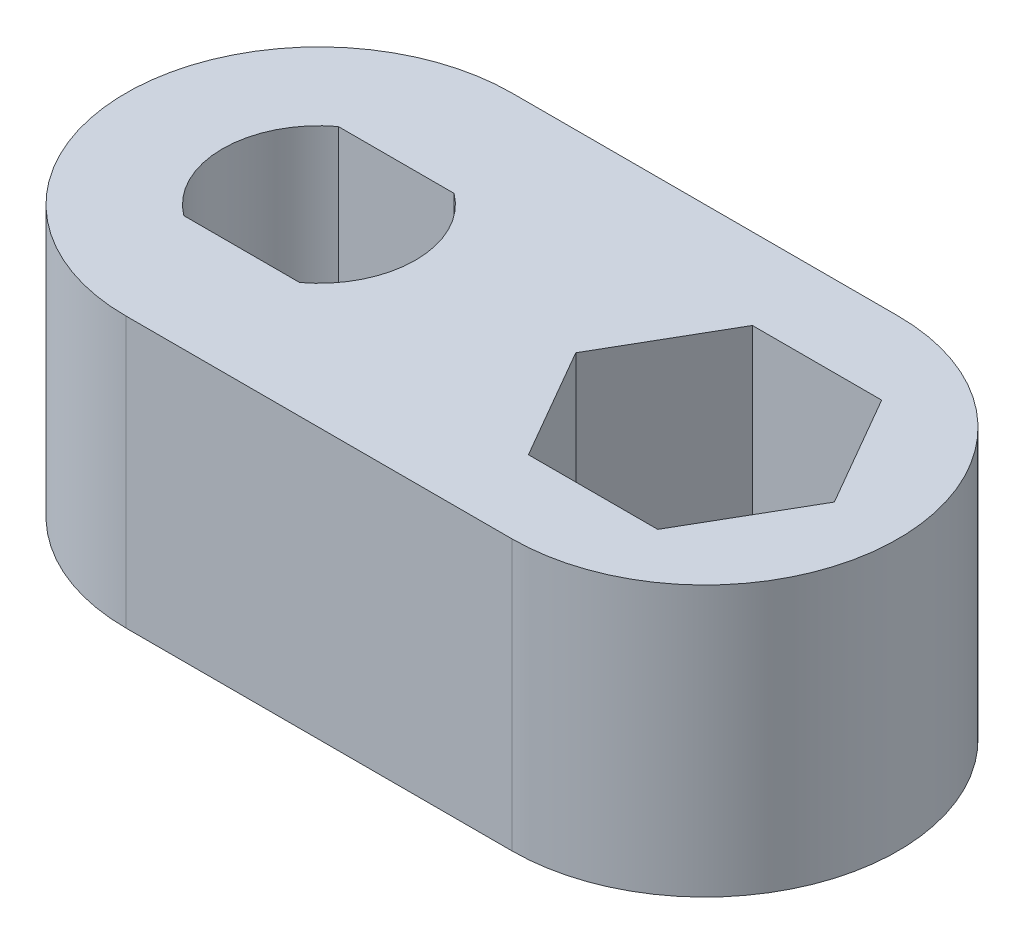
ISO-10303-21;
HEADER;
FILE_DESCRIPTION(('STEP AP214'),'2;1');
FILE_NAME('part.step','',(''),(''),'','','');
FILE_SCHEMA(('AUTOMOTIVE_DESIGN { 1 0 10303 214 1 1 1 1 }'));
ENDSEC;
DATA;
#1=APPLICATION_CONTEXT('core data for automotive mechanical design processes');
#2=APPLICATION_PROTOCOL_DEFINITION('international standard','automotive_design',2000,#1);
#3=PRODUCT_CONTEXT('',#1,'mechanical');
#4=PRODUCT('Part','Part','',(#3));
#5=PRODUCT_RELATED_PRODUCT_CATEGORY('part','',(#4));
#6=PRODUCT_DEFINITION_FORMATION('','',#4);
#7=PRODUCT_DEFINITION_CONTEXT('part definition',#1,'design');
#8=PRODUCT_DEFINITION('design','',#6,#7);
#9=PRODUCT_DEFINITION_SHAPE('','',#8);
#10=(LENGTH_UNIT() NAMED_UNIT(*) SI_UNIT(.MILLI.,.METRE.));
#11=(NAMED_UNIT(*) PLANE_ANGLE_UNIT() SI_UNIT($,.RADIAN.));
#12=(NAMED_UNIT(*) SI_UNIT($,.STERADIAN.) SOLID_ANGLE_UNIT());
#13=UNCERTAINTY_MEASURE_WITH_UNIT(LENGTH_MEASURE(1.E-05),#10,'distance_accuracy_value','');
#14=(GEOMETRIC_REPRESENTATION_CONTEXT(3) GLOBAL_UNCERTAINTY_ASSIGNED_CONTEXT((#13)) GLOBAL_UNIT_ASSIGNED_CONTEXT((#10,
#11,#12)) REPRESENTATION_CONTEXT('',''));
#15=CARTESIAN_POINT('',(0.,0.,0.));
#16=DIRECTION('',(0.,0.,1.));
#17=DIRECTION('',(1.,0.,0.));
#18=AXIS2_PLACEMENT_3D('',#15,#16,#17);
#19=CARTESIAN_POINT('',(10.,7.,0.));
#20=DIRECTION('',(0.,1.,0.));
#21=DIRECTION('',(0.,0.,1.));
#22=AXIS2_PLACEMENT_3D('',#19,#20,#21);
#23=CYLINDRICAL_SURFACE('',#22,2.07500000000001);
#24=CARTESIAN_POINT('',(10.,0.,0.));
#25=DIRECTION('',(0.,1.,0.));
#26=DIRECTION('',(0.,0.,1.));
#27=AXIS2_PLACEMENT_3D('',#24,#25,#26);
#28=CIRCLE('',#27,2.07500000000001);
#29=CARTESIAN_POINT('',(10.,0.,2.07500000000001));
#30=VERTEX_POINT('',#29);
#31=EDGE_CURVE('E202',#30,#30,#28,.T.);
#32=ORIENTED_EDGE('',*,*,#31,.F.);
#33=EDGE_LOOP('',(#32));
#34=FACE_BOUND('',#33,.T.);
#35=CARTESIAN_POINT('',(10.,2.,0.));
#36=DIRECTION('',(0.,1.,0.));
#37=DIRECTION('',(0.,0.,1.));
#38=AXIS2_PLACEMENT_3D('',#35,#36,#37);
#39=CIRCLE('',#38,2.07500000000001);
#40=CARTESIAN_POINT('',(10.,2.,2.07500000000001));
#41=VERTEX_POINT('',#40);
#42=EDGE_CURVE('E44',#41,#41,#39,.F.);
#43=ORIENTED_EDGE('',*,*,#42,.F.);
#44=EDGE_LOOP('',(#43));
#45=FACE_BOUND('',#44,.T.);
#46=ADVANCED_FACE('F40',(#34,#45),#23,.F.);
#47=CARTESIAN_POINT('',(0.,7.,5.));
#48=DIRECTION('',(0.,0.,-1.));
#49=DIRECTION('',(-1.,0.,0.));
#50=AXIS2_PLACEMENT_3D('',#47,#48,#49);
#51=PLANE('',#50);
#52=DIRECTION('',(1.,0.,0.));
#53=VECTOR('',#52,1.);
#54=CARTESIAN_POINT('',(0.,0.,5.));
#55=LINE('',#54,#53);
#56=CARTESIAN_POINT('',(0.,0.,5.));
#57=VERTEX_POINT('',#56);
#58=CARTESIAN_POINT('',(10.,0.,5.));
#59=VERTEX_POINT('',#58);
#60=EDGE_CURVE('E225',#57,#59,#55,.T.);
#61=ORIENTED_EDGE('',*,*,#60,.T.);
#62=DIRECTION('',(0.,-1.,0.));
#63=VECTOR('',#62,1.);
#64=CARTESIAN_POINT('',(10.,7.,5.));
#65=LINE('',#64,#63);
#66=CARTESIAN_POINT('',(10.,7.,5.));
#67=VERTEX_POINT('',#66);
#68=EDGE_CURVE('E11',#67,#59,#65,.T.);
#69=ORIENTED_EDGE('',*,*,#68,.F.);
#70=DIRECTION('',(1.,0.,0.));
#71=VECTOR('',#70,1.);
#72=CARTESIAN_POINT('',(0.,7.,5.));
#73=LINE('',#72,#71);
#74=CARTESIAN_POINT('',(0.,7.,5.));
#75=VERTEX_POINT('',#74);
#76=EDGE_CURVE('E232',#75,#67,#73,.T.);
#77=ORIENTED_EDGE('',*,*,#76,.F.);
#78=DIRECTION('',(0.,-1.,0.));
#79=VECTOR('',#78,1.);
#80=CARTESIAN_POINT('',(0.,7.,5.));
#81=LINE('',#80,#79);
#82=EDGE_CURVE('E243',#75,#57,#81,.T.);
#83=ORIENTED_EDGE('',*,*,#82,.T.);
#84=EDGE_LOOP('',(#61,#69,#77,#83));
#85=FACE_BOUND('',#84,.T.);
#86=ADVANCED_FACE('F42',(#85),#51,.F.);
#87=CARTESIAN_POINT('',(10.,7.,0.));
#88=DIRECTION('',(0.,-1.,0.));
#89=DIRECTION('',(0.,0.,-1.));
#90=AXIS2_PLACEMENT_3D('',#87,#88,#89);
#91=CYLINDRICAL_SURFACE('',#90,5.);
#92=CARTESIAN_POINT('',(10.,0.,0.));
#93=DIRECTION('',(0.,1.,0.));
#94=DIRECTION('',(0.,0.,1.));
#95=AXIS2_PLACEMENT_3D('',#92,#93,#94);
#96=CIRCLE('',#95,5.);
#97=CARTESIAN_POINT('',(10.,0.,-5.));
#98=VERTEX_POINT('',#97);
#99=EDGE_CURVE('E246',#59,#98,#96,.T.);
#100=ORIENTED_EDGE('',*,*,#99,.T.);
#101=DIRECTION('',(0.,-1.,0.));
#102=VECTOR('',#101,1.);
#103=CARTESIAN_POINT('',(10.,7.,-5.));
#104=LINE('',#103,#102);
#105=CARTESIAN_POINT('',(10.,7.,-5.));
#106=VERTEX_POINT('',#105);
#107=EDGE_CURVE('E49',#106,#98,#104,.T.);
#108=ORIENTED_EDGE('',*,*,#107,.F.);
#109=CARTESIAN_POINT('',(10.,7.,0.));
#110=DIRECTION('',(0.,1.,0.));
#111=DIRECTION('',(0.,0.,1.));
#112=AXIS2_PLACEMENT_3D('',#109,#110,#111);
#113=CIRCLE('',#112,5.);
#114=EDGE_CURVE('E235',#67,#106,#113,.T.);
#115=ORIENTED_EDGE('',*,*,#114,.F.);
#116=ORIENTED_EDGE('',*,*,#68,.T.);
#117=EDGE_LOOP('',(#100,#108,#115,#116));
#118=FACE_BOUND('',#117,.T.);
#119=ADVANCED_FACE('F273',(#118),#91,.T.);
#120=CARTESIAN_POINT('',(0.,7.,-5.));
#121=DIRECTION('',(0.,0.,-1.));
#122=DIRECTION('',(-1.,0.,0.));
#123=AXIS2_PLACEMENT_3D('',#120,#121,#122);
#124=PLANE('',#123);
#125=DIRECTION('',(1.,0.,0.));
#126=VECTOR('',#125,1.);
#127=CARTESIAN_POINT('',(0.,0.,-5.));
#128=LINE('',#127,#126);
#129=CARTESIAN_POINT('',(0.,0.,-5.));
#130=VERTEX_POINT('',#129);
#131=EDGE_CURVE('E249',#130,#98,#128,.T.);
#132=ORIENTED_EDGE('',*,*,#131,.F.);
#133=DIRECTION('',(0.,-1.,0.));
#134=VECTOR('',#133,1.);
#135=CARTESIAN_POINT('',(0.,7.,-5.));
#136=LINE('',#135,#134);
#137=CARTESIAN_POINT('',(0.,7.,-5.));
#138=VERTEX_POINT('',#137);
#139=EDGE_CURVE('E255',#138,#130,#136,.T.);
#140=ORIENTED_EDGE('',*,*,#139,.F.);
#141=DIRECTION('',(1.,0.,0.));
#142=VECTOR('',#141,1.);
#143=CARTESIAN_POINT('',(0.,7.,-5.));
#144=LINE('',#143,#142);
#145=EDGE_CURVE('E238',#138,#106,#144,.T.);
#146=ORIENTED_EDGE('',*,*,#145,.T.);
#147=ORIENTED_EDGE('',*,*,#107,.T.);
#148=EDGE_LOOP('',(#132,#140,#146,#147));
#149=FACE_BOUND('',#148,.T.);
#150=ADVANCED_FACE('F311',(#149),#124,.T.);
#151=CARTESIAN_POINT('',(0.,7.,0.));
#152=DIRECTION('',(0.,-1.,0.));
#153=DIRECTION('',(0.,0.,-1.));
#154=AXIS2_PLACEMENT_3D('',#151,#152,#153);
#155=CYLINDRICAL_SURFACE('',#154,5.);
#156=CARTESIAN_POINT('',(0.,0.,0.));
#157=DIRECTION('',(0.,1.,0.));
#158=DIRECTION('',(0.,0.,1.));
#159=AXIS2_PLACEMENT_3D('',#156,#157,#158);
#160=CIRCLE('',#159,5.);
#161=EDGE_CURVE('E236',#130,#57,#160,.T.);
#162=ORIENTED_EDGE('',*,*,#161,.T.);
#163=ORIENTED_EDGE('',*,*,#82,.F.);
#164=CARTESIAN_POINT('',(0.,7.,0.));
#165=DIRECTION('',(0.,1.,0.));
#166=DIRECTION('',(0.,0.,1.));
#167=AXIS2_PLACEMENT_3D('',#164,#165,#166);
#168=CIRCLE('',#167,5.);
#169=EDGE_CURVE('E241',#138,#75,#168,.T.);
#170=ORIENTED_EDGE('',*,*,#169,.F.);
#171=ORIENTED_EDGE('',*,*,#139,.T.);
#172=EDGE_LOOP('',(#162,#163,#170,#171));
#173=FACE_BOUND('',#172,.T.);
#174=ADVANCED_FACE('F305',(#173),#155,.T.);
#175=CARTESIAN_POINT('',(0.,7.,0.));
#176=DIRECTION('',(0.,1.,0.));
#177=DIRECTION('',(0.,0.,1.));
#178=AXIS2_PLACEMENT_3D('',#175,#176,#177);
#179=PLANE('',#178);
#180=DIRECTION('',(0.499999999999999,0.,-0.866025403784439));
#181=VECTOR('',#180,1.);
#182=CARTESIAN_POINT('',(11.6743157806499,7.,2.90000000000001));
#183=LINE('',#182,#181);
#184=CARTESIAN_POINT('',(11.6743157806499,7.,2.90000000000001));
#185=VERTEX_POINT('',#184);
#186=CARTESIAN_POINT('',(13.3486315612998,7.,0.));
#187=VERTEX_POINT('',#186);
#188=EDGE_CURVE('E57',#185,#187,#183,.T.);
#189=ORIENTED_EDGE('',*,*,#188,.F.);
#190=DIRECTION('',(1.,0.,0.));
#191=VECTOR('',#190,1.);
#192=CARTESIAN_POINT('',(8.32568421935009,7.,2.90000000000001));
#193=LINE('',#192,#191);
#194=CARTESIAN_POINT('',(8.32568421935009,7.,2.90000000000001));
#195=VERTEX_POINT('',#194);
#196=EDGE_CURVE('E165',#195,#185,#193,.T.);
#197=ORIENTED_EDGE('',*,*,#196,.F.);
#198=DIRECTION('',(0.5,0.,0.866025403784439));
#199=VECTOR('',#198,1.);
#200=CARTESIAN_POINT('',(6.65136843870017,7.,0.));
#201=LINE('',#200,#199);
#202=CARTESIAN_POINT('',(6.65136843870017,7.,0.));
#203=VERTEX_POINT('',#202);
#204=EDGE_CURVE('E168',#203,#195,#201,.T.);
#205=ORIENTED_EDGE('',*,*,#204,.F.);
#206=DIRECTION('',(-0.5,0.,0.866025403784438));
#207=VECTOR('',#206,1.);
#208=CARTESIAN_POINT('',(8.32568421935009,7.,-2.9));
#209=LINE('',#208,#207);
#210=CARTESIAN_POINT('',(8.32568421935009,7.,-2.9));
#211=VERTEX_POINT('',#210);
#212=EDGE_CURVE('E184',#211,#203,#209,.T.);
#213=ORIENTED_EDGE('',*,*,#212,.F.);
#214=DIRECTION('',(-1.,0.,0.));
#215=VECTOR('',#214,1.);
#216=CARTESIAN_POINT('',(11.6743157806499,7.,-2.9));
#217=LINE('',#216,#215);
#218=CARTESIAN_POINT('',(11.6743157806499,7.,-2.9));
#219=VERTEX_POINT('',#218);
#220=EDGE_CURVE('E181',#219,#211,#217,.T.);
#221=ORIENTED_EDGE('',*,*,#220,.F.);
#222=DIRECTION('',(-0.5,0.,-0.866025403784439));
#223=VECTOR('',#222,1.);
#224=CARTESIAN_POINT('',(13.3486315612998,7.,0.));
#225=LINE('',#224,#223);
#226=EDGE_CURVE('E179',#187,#219,#225,.T.);
#227=ORIENTED_EDGE('',*,*,#226,.F.);
#228=EDGE_LOOP('',(#189,#197,#205,#213,#221,#227));
#229=FACE_BOUND('',#228,.T.);
#230=DIRECTION('',(1.,0.,0.));
#231=VECTOR('',#230,1.);
#232=CARTESIAN_POINT('',(0.,7.,2.));
#233=LINE('',#232,#231);
#234=CARTESIAN_POINT('',(-1.5,7.,2.));
#235=VERTEX_POINT('',#234);
#236=CARTESIAN_POINT('',(1.5,7.,2.));
#237=VERTEX_POINT('',#236);
#238=EDGE_CURVE('E65',#235,#237,#233,.T.);
#239=ORIENTED_EDGE('',*,*,#238,.F.);
#240=CARTESIAN_POINT('',(0.,7.,0.));
#241=DIRECTION('',(0.,1.,0.));
#242=DIRECTION('',(0.,0.,1.));
#243=AXIS2_PLACEMENT_3D('',#240,#241,#242);
#244=CIRCLE('',#243,2.5);
#245=CARTESIAN_POINT('',(-1.5,7.,-2.));
#246=VERTEX_POINT('',#245);
#247=EDGE_CURVE('E210',#246,#235,#244,.T.);
#248=ORIENTED_EDGE('',*,*,#247,.F.);
#249=DIRECTION('',(1.,0.,0.));
#250=VECTOR('',#249,1.);
#251=CARTESIAN_POINT('',(0.,7.,-2.));
#252=LINE('',#251,#250);
#253=CARTESIAN_POINT('',(1.5,7.,-2.));
#254=VERTEX_POINT('',#253);
#255=EDGE_CURVE('E220',#246,#254,#252,.T.);
#256=ORIENTED_EDGE('',*,*,#255,.T.);
#257=EDGE_CURVE('E217',#237,#254,#244,.T.);
#258=ORIENTED_EDGE('',*,*,#257,.F.);
#259=EDGE_LOOP('',(#239,#248,#256,#258));
#260=FACE_BOUND('',#259,.T.);
#261=ORIENTED_EDGE('',*,*,#76,.T.);
#262=ORIENTED_EDGE('',*,*,#114,.T.);
#263=ORIENTED_EDGE('',*,*,#145,.F.);
#264=ORIENTED_EDGE('',*,*,#169,.T.);
#265=EDGE_LOOP('',(#261,#262,#263,#264));
#266=FACE_BOUND('',#265,.T.);
#267=ADVANCED_FACE('F303',(#229,#260,#266),#179,.T.);
#268=CARTESIAN_POINT('',(0.,0.,0.));
#269=DIRECTION('',(0.,1.,0.));
#270=DIRECTION('',(0.,0.,1.));
#271=AXIS2_PLACEMENT_3D('',#268,#269,#270);
#272=PLANE('',#271);
#273=ORIENTED_EDGE('',*,*,#31,.T.);
#274=EDGE_LOOP('',(#273));
#275=FACE_BOUND('',#274,.T.);
#276=CARTESIAN_POINT('',(0.,0.,0.));
#277=DIRECTION('',(0.,-1.,0.));
#278=DIRECTION('',(0.,0.,-1.));
#279=AXIS2_PLACEMENT_3D('',#276,#277,#278);
#280=CIRCLE('',#279,3.36);
#281=CARTESIAN_POINT('',(0.,0.,-3.36));
#282=VERTEX_POINT('',#281);
#283=EDGE_CURVE('E198',#282,#282,#280,.T.);
#284=ORIENTED_EDGE('',*,*,#283,.F.);
#285=EDGE_LOOP('',(#284));
#286=FACE_BOUND('',#285,.T.);
#287=ORIENTED_EDGE('',*,*,#60,.F.);
#288=ORIENTED_EDGE('',*,*,#161,.F.);
#289=ORIENTED_EDGE('',*,*,#131,.T.);
#290=ORIENTED_EDGE('',*,*,#99,.F.);
#291=EDGE_LOOP('',(#287,#288,#289,#290));
#292=FACE_BOUND('',#291,.T.);
#293=ADVANCED_FACE('F302',(#275,#286,#292),#272,.F.);
#294=CARTESIAN_POINT('',(0.,3.,2.));
#295=DIRECTION('',(0.,0.,1.));
#296=DIRECTION('',(1.,0.,0.));
#297=AXIS2_PLACEMENT_3D('',#294,#295,#296);
#298=PLANE('',#297);
#299=ORIENTED_EDGE('',*,*,#238,.T.);
#300=DIRECTION('',(0.,1.,0.));
#301=VECTOR('',#300,1.);
#302=CARTESIAN_POINT('',(1.5,3.,2.));
#303=LINE('',#302,#301);
#304=CARTESIAN_POINT('',(1.5,3.,2.));
#305=VERTEX_POINT('',#304);
#306=EDGE_CURVE('E230',#305,#237,#303,.T.);
#307=ORIENTED_EDGE('',*,*,#306,.F.);
#308=DIRECTION('',(1.,0.,0.));
#309=VECTOR('',#308,1.);
#310=CARTESIAN_POINT('',(0.,3.,2.));
#311=LINE('',#310,#309);
#312=CARTESIAN_POINT('',(-1.5,3.,2.));
#313=VERTEX_POINT('',#312);
#314=EDGE_CURVE('E206',#313,#305,#311,.T.);
#315=ORIENTED_EDGE('',*,*,#314,.F.);
#316=DIRECTION('',(0.,1.,0.));
#317=VECTOR('',#316,1.);
#318=CARTESIAN_POINT('',(-1.5,3.,2.));
#319=LINE('',#318,#317);
#320=EDGE_CURVE('E223',#313,#235,#319,.T.);
#321=ORIENTED_EDGE('',*,*,#320,.T.);
#322=EDGE_LOOP('',(#299,#307,#315,#321));
#323=FACE_BOUND('',#322,.T.);
#324=ADVANCED_FACE('F295',(#323),#298,.F.);
#325=CARTESIAN_POINT('',(0.,3.,0.));
#326=DIRECTION('',(0.,1.,0.));
#327=DIRECTION('',(0.,0.,1.));
#328=AXIS2_PLACEMENT_3D('',#325,#326,#327);
#329=CYLINDRICAL_SURFACE('',#328,2.5);
#330=ORIENTED_EDGE('',*,*,#247,.T.);
#331=ORIENTED_EDGE('',*,*,#320,.F.);
#332=CARTESIAN_POINT('',(0.,3.,0.));
#333=DIRECTION('',(0.,1.,0.));
#334=DIRECTION('',(0.,0.,1.));
#335=AXIS2_PLACEMENT_3D('',#332,#333,#334);
#336=CIRCLE('',#335,2.5);
#337=CARTESIAN_POINT('',(-1.5,3.,-2.));
#338=VERTEX_POINT('',#337);
#339=EDGE_CURVE('E214',#338,#313,#336,.T.);
#340=ORIENTED_EDGE('',*,*,#339,.F.);
#341=DIRECTION('',(0.,1.,0.));
#342=VECTOR('',#341,1.);
#343=CARTESIAN_POINT('',(-1.5,3.,-2.));
#344=LINE('',#343,#342);
#345=EDGE_CURVE('E226',#338,#246,#344,.T.);
#346=ORIENTED_EDGE('',*,*,#345,.T.);
#347=EDGE_LOOP('',(#330,#331,#340,#346));
#348=FACE_BOUND('',#347,.T.);
#349=ADVANCED_FACE('F291',(#348),#329,.F.);
#350=CARTESIAN_POINT('',(0.,3.,-2.));
#351=DIRECTION('',(0.,0.,1.));
#352=DIRECTION('',(1.,0.,0.));
#353=AXIS2_PLACEMENT_3D('',#350,#351,#352);
#354=PLANE('',#353);
#355=ORIENTED_EDGE('',*,*,#255,.F.);
#356=ORIENTED_EDGE('',*,*,#345,.F.);
#357=DIRECTION('',(1.,0.,0.));
#358=VECTOR('',#357,1.);
#359=CARTESIAN_POINT('',(0.,3.,-2.));
#360=LINE('',#359,#358);
#361=CARTESIAN_POINT('',(1.5,3.,-2.));
#362=VERTEX_POINT('',#361);
#363=EDGE_CURVE('E213',#338,#362,#360,.T.);
#364=ORIENTED_EDGE('',*,*,#363,.T.);
#365=DIRECTION('',(0.,1.,0.));
#366=VECTOR('',#365,1.);
#367=CARTESIAN_POINT('',(1.5,3.,-2.));
#368=LINE('',#367,#366);
#369=EDGE_CURVE('E228',#362,#254,#368,.T.);
#370=ORIENTED_EDGE('',*,*,#369,.T.);
#371=EDGE_LOOP('',(#355,#356,#364,#370));
#372=FACE_BOUND('',#371,.T.);
#373=ADVANCED_FACE('F294',(#372),#354,.T.);
#374=ORIENTED_EDGE('',*,*,#257,.T.);
#375=ORIENTED_EDGE('',*,*,#369,.F.);
#376=EDGE_CURVE('E209',#305,#362,#336,.T.);
#377=ORIENTED_EDGE('',*,*,#376,.F.);
#378=ORIENTED_EDGE('',*,*,#306,.T.);
#379=EDGE_LOOP('',(#374,#375,#377,#378));
#380=FACE_BOUND('',#379,.T.);
#381=ADVANCED_FACE('F289',(#380),#329,.F.);
#382=CARTESIAN_POINT('',(0.,3.,0.));
#383=DIRECTION('',(0.,1.,0.));
#384=DIRECTION('',(0.,0.,1.));
#385=AXIS2_PLACEMENT_3D('',#382,#383,#384);
#386=PLANE('',#385);
#387=CARTESIAN_POINT('',(0.,3.,0.));
#388=DIRECTION('',(0.,1.,0.));
#389=DIRECTION('',(0.,0.,1.));
#390=AXIS2_PLACEMENT_3D('',#387,#388,#389);
#391=CIRCLE('',#390,1.7);
#392=CARTESIAN_POINT('',(0.,3.,1.7));
#393=VERTEX_POINT('',#392);
#394=EDGE_CURVE('E205',#393,#393,#391,.T.);
#395=ORIENTED_EDGE('',*,*,#394,.F.);
#396=EDGE_LOOP('',(#395));
#397=FACE_BOUND('',#396,.T.);
#398=ORIENTED_EDGE('',*,*,#314,.T.);
#399=ORIENTED_EDGE('',*,*,#376,.T.);
#400=ORIENTED_EDGE('',*,*,#363,.F.);
#401=ORIENTED_EDGE('',*,*,#339,.T.);
#402=EDGE_LOOP('',(#398,#399,#400,#401));
#403=FACE_BOUND('',#402,.T.);
#404=ADVANCED_FACE('F285',(#397,#403),#386,.T.);
#405=CARTESIAN_POINT('',(0.,0.,0.));
#406=DIRECTION('',(0.,-1.,0.));
#407=DIRECTION('',(0.,0.,-1.));
#408=AXIS2_PLACEMENT_3D('',#405,#406,#407);
#409=CYLINDRICAL_SURFACE('',#408,1.7);
#410=ORIENTED_EDGE('',*,*,#394,.T.);
#411=EDGE_LOOP('',(#410));
#412=FACE_BOUND('',#411,.T.);
#413=CARTESIAN_POINT('',(0.,1.66,0.));
#414=DIRECTION('',(0.,-1.,0.));
#415=DIRECTION('',(0.,0.,-1.));
#416=AXIS2_PLACEMENT_3D('',#413,#414,#415);
#417=CIRCLE('',#416,1.7);
#418=CARTESIAN_POINT('',(0.,1.66,-1.7));
#419=VERTEX_POINT('',#418);
#420=EDGE_CURVE('E201',#419,#419,#417,.T.);
#421=ORIENTED_EDGE('',*,*,#420,.T.);
#422=EDGE_LOOP('',(#421));
#423=FACE_BOUND('',#422,.T.);
#424=ADVANCED_FACE('F281',(#412,#423),#409,.F.);
#425=CARTESIAN_POINT('',(0.,0.,0.));
#426=DIRECTION('',(0.,-1.,0.));
#427=DIRECTION('',(0.,0.,-1.));
#428=AXIS2_PLACEMENT_3D('',#425,#426,#427);
#429=CONICAL_SURFACE('',#428,3.36,0.785398163397448);
#430=ORIENTED_EDGE('',*,*,#420,.F.);
#431=EDGE_LOOP('',(#430));
#432=FACE_BOUND('',#431,.T.);
#433=ORIENTED_EDGE('',*,*,#283,.T.);
#434=EDGE_LOOP('',(#433));
#435=FACE_BOUND('',#434,.T.);
#436=ADVANCED_FACE('F278',(#432,#435),#429,.F.);
#437=CARTESIAN_POINT('',(0.,2.,0.));
#438=DIRECTION('',(0.,1.,0.));
#439=DIRECTION('',(0.,0.,1.));
#440=AXIS2_PLACEMENT_3D('',#437,#438,#439);
#441=PLANE('',#440);
#442=DIRECTION('',(0.499999999999999,0.,-0.866025403784439));
#443=VECTOR('',#442,1.);
#444=CARTESIAN_POINT('',(11.6743157806499,2.,2.90000000000001));
#445=LINE('',#444,#443);
#446=CARTESIAN_POINT('',(11.6743157806499,2.,2.90000000000001));
#447=VERTEX_POINT('',#446);
#448=CARTESIAN_POINT('',(13.3486315612998,2.,0.));
#449=VERTEX_POINT('',#448);
#450=EDGE_CURVE('E145',#447,#449,#445,.T.);
#451=ORIENTED_EDGE('',*,*,#450,.T.);
#452=DIRECTION('',(-0.5,0.,-0.866025403784439));
#453=VECTOR('',#452,1.);
#454=CARTESIAN_POINT('',(13.3486315612998,2.,0.));
#455=LINE('',#454,#453);
#456=CARTESIAN_POINT('',(11.6743157806499,2.,-2.9));
#457=VERTEX_POINT('',#456);
#458=EDGE_CURVE('E154',#449,#457,#455,.T.);
#459=ORIENTED_EDGE('',*,*,#458,.T.);
#460=DIRECTION('',(-1.,0.,0.));
#461=VECTOR('',#460,1.);
#462=CARTESIAN_POINT('',(11.6743157806499,2.,-2.9));
#463=LINE('',#462,#461);
#464=CARTESIAN_POINT('',(8.32568421935009,2.,-2.9));
#465=VERTEX_POINT('',#464);
#466=EDGE_CURVE('E159',#457,#465,#463,.T.);
#467=ORIENTED_EDGE('',*,*,#466,.T.);
#468=DIRECTION('',(-0.5,0.,0.866025403784438));
#469=VECTOR('',#468,1.);
#470=CARTESIAN_POINT('',(8.32568421935009,2.,-2.9));
#471=LINE('',#470,#469);
#472=CARTESIAN_POINT('',(6.65136843870017,2.,0.));
#473=VERTEX_POINT('',#472);
#474=EDGE_CURVE('E172',#465,#473,#471,.T.);
#475=ORIENTED_EDGE('',*,*,#474,.T.);
#476=DIRECTION('',(0.5,0.,0.866025403784439));
#477=VECTOR('',#476,1.);
#478=CARTESIAN_POINT('',(6.65136843870017,2.,0.));
#479=LINE('',#478,#477);
#480=CARTESIAN_POINT('',(8.32568421935009,2.,2.90000000000001));
#481=VERTEX_POINT('',#480);
#482=EDGE_CURVE('E175',#473,#481,#479,.T.);
#483=ORIENTED_EDGE('',*,*,#482,.T.);
#484=DIRECTION('',(1.,0.,0.));
#485=VECTOR('',#484,1.);
#486=CARTESIAN_POINT('',(8.32568421935009,2.,2.90000000000001));
#487=LINE('',#486,#485);
#488=EDGE_CURVE('E151',#481,#447,#487,.T.);
#489=ORIENTED_EDGE('',*,*,#488,.T.);
#490=EDGE_LOOP('',(#451,#459,#467,#475,#483,#489));
#491=FACE_BOUND('',#490,.T.);
#492=ORIENTED_EDGE('',*,*,#42,.T.);
#493=EDGE_LOOP('',(#492));
#494=FACE_BOUND('',#493,.T.);
#495=ADVANCED_FACE('F161',(#491,#494),#441,.T.);
#496=CARTESIAN_POINT('',(11.6743157806499,2.,2.90000000000001));
#497=DIRECTION('',(0.866025403784439,0.,0.5));
#498=DIRECTION('',(0.5,0.,-0.866025403784439));
#499=AXIS2_PLACEMENT_3D('',#496,#497,#498);
#500=PLANE('',#499);
#501=ORIENTED_EDGE('',*,*,#188,.T.);
#502=DIRECTION('',(0.,1.,0.));
#503=VECTOR('',#502,1.);
#504=CARTESIAN_POINT('',(13.3486315612998,2.,0.));
#505=LINE('',#504,#503);
#506=EDGE_CURVE('E141',#449,#187,#505,.T.);
#507=ORIENTED_EDGE('',*,*,#506,.F.);
#508=ORIENTED_EDGE('',*,*,#450,.F.);
#509=DIRECTION('',(0.,1.,0.));
#510=VECTOR('',#509,1.);
#511=CARTESIAN_POINT('',(11.6743157806499,2.,2.90000000000001));
#512=LINE('',#511,#510);
#513=EDGE_CURVE('E189',#447,#185,#512,.T.);
#514=ORIENTED_EDGE('',*,*,#513,.T.);
#515=EDGE_LOOP('',(#501,#507,#508,#514));
#516=FACE_BOUND('',#515,.T.);
#517=ADVANCED_FACE('F143',(#516),#500,.F.);
#518=CARTESIAN_POINT('',(8.32568421935009,2.,2.90000000000001));
#519=DIRECTION('',(0.,0.,1.));
#520=DIRECTION('',(1.,0.,0.));
#521=AXIS2_PLACEMENT_3D('',#518,#519,#520);
#522=PLANE('',#521);
#523=ORIENTED_EDGE('',*,*,#196,.T.);
#524=ORIENTED_EDGE('',*,*,#513,.F.);
#525=ORIENTED_EDGE('',*,*,#488,.F.);
#526=DIRECTION('',(0.,1.,0.));
#527=VECTOR('',#526,1.);
#528=CARTESIAN_POINT('',(8.32568421935009,2.,2.90000000000001));
#529=LINE('',#528,#527);
#530=EDGE_CURVE('E191',#481,#195,#529,.T.);
#531=ORIENTED_EDGE('',*,*,#530,.T.);
#532=EDGE_LOOP('',(#523,#524,#525,#531));
#533=FACE_BOUND('',#532,.T.);
#534=ADVANCED_FACE('F397',(#533),#522,.F.);
#535=CARTESIAN_POINT('',(6.65136843870017,2.,0.));
#536=DIRECTION('',(-0.866025403784439,0.,0.5));
#537=DIRECTION('',(0.5,0.,0.866025403784439));
#538=AXIS2_PLACEMENT_3D('',#535,#536,#537);
#539=PLANE('',#538);
#540=ORIENTED_EDGE('',*,*,#204,.T.);
#541=ORIENTED_EDGE('',*,*,#530,.F.);
#542=ORIENTED_EDGE('',*,*,#482,.F.);
#543=DIRECTION('',(0.,1.,0.));
#544=VECTOR('',#543,1.);
#545=CARTESIAN_POINT('',(6.65136843870017,2.,0.));
#546=LINE('',#545,#544);
#547=EDGE_CURVE('E193',#473,#203,#546,.T.);
#548=ORIENTED_EDGE('',*,*,#547,.T.);
#549=EDGE_LOOP('',(#540,#541,#542,#548));
#550=FACE_BOUND('',#549,.T.);
#551=ADVANCED_FACE('F403',(#550),#539,.F.);
#552=CARTESIAN_POINT('',(8.32568421935009,2.,-2.9));
#553=DIRECTION('',(-0.866025403784439,0.,-0.5));
#554=DIRECTION('',(-0.5,0.,0.866025403784439));
#555=AXIS2_PLACEMENT_3D('',#552,#553,#554);
#556=PLANE('',#555);
#557=ORIENTED_EDGE('',*,*,#212,.T.);
#558=ORIENTED_EDGE('',*,*,#547,.F.);
#559=ORIENTED_EDGE('',*,*,#474,.F.);
#560=DIRECTION('',(0.,1.,0.));
#561=VECTOR('',#560,1.);
#562=CARTESIAN_POINT('',(8.32568421935009,2.,-2.9));
#563=LINE('',#562,#561);
#564=EDGE_CURVE('E195',#465,#211,#563,.T.);
#565=ORIENTED_EDGE('',*,*,#564,.T.);
#566=EDGE_LOOP('',(#557,#558,#559,#565));
#567=FACE_BOUND('',#566,.T.);
#568=ADVANCED_FACE('F411',(#567),#556,.F.);
#569=CARTESIAN_POINT('',(11.6743157806499,2.,-2.9));
#570=DIRECTION('',(0.,0.,-1.));
#571=DIRECTION('',(-1.,0.,0.));
#572=AXIS2_PLACEMENT_3D('',#569,#570,#571);
#573=PLANE('',#572);
#574=ORIENTED_EDGE('',*,*,#220,.T.);
#575=ORIENTED_EDGE('',*,*,#564,.F.);
#576=ORIENTED_EDGE('',*,*,#466,.F.);
#577=DIRECTION('',(0.,1.,0.));
#578=VECTOR('',#577,1.);
#579=CARTESIAN_POINT('',(11.6743157806499,2.,-2.9));
#580=LINE('',#579,#578);
#581=EDGE_CURVE('E150',#457,#219,#580,.T.);
#582=ORIENTED_EDGE('',*,*,#581,.T.);
#583=EDGE_LOOP('',(#574,#575,#576,#582));
#584=FACE_BOUND('',#583,.T.);
#585=ADVANCED_FACE('F419',(#584),#573,.F.);
#586=CARTESIAN_POINT('',(13.3486315612998,2.,0.));
#587=DIRECTION('',(0.866025403784439,0.,-0.5));
#588=DIRECTION('',(-0.5,0.,-0.866025403784439));
#589=AXIS2_PLACEMENT_3D('',#586,#587,#588);
#590=PLANE('',#589);
#591=ORIENTED_EDGE('',*,*,#226,.T.);
#592=ORIENTED_EDGE('',*,*,#581,.F.);
#593=ORIENTED_EDGE('',*,*,#458,.F.);
#594=ORIENTED_EDGE('',*,*,#506,.T.);
#595=EDGE_LOOP('',(#591,#592,#593,#594));
#596=FACE_BOUND('',#595,.T.);
#597=ADVANCED_FACE('F155',(#596),#590,.F.);
#598=CLOSED_SHELL('',(#46,#86,#119,#150,#174,#267,#293,#324,#349,#373,#381,#404,#424,#436,#495,
#517,#534,#551,#568,#585,#597));
#599=MANIFOLD_SOLID_BREP('B2',#598);
#600=ADVANCED_BREP_SHAPE_REPRESENTATION('',(#18,#599),#14);
#601=SHAPE_DEFINITION_REPRESENTATION(#9,#600);
ENDSEC;
END-ISO-10303-21;
